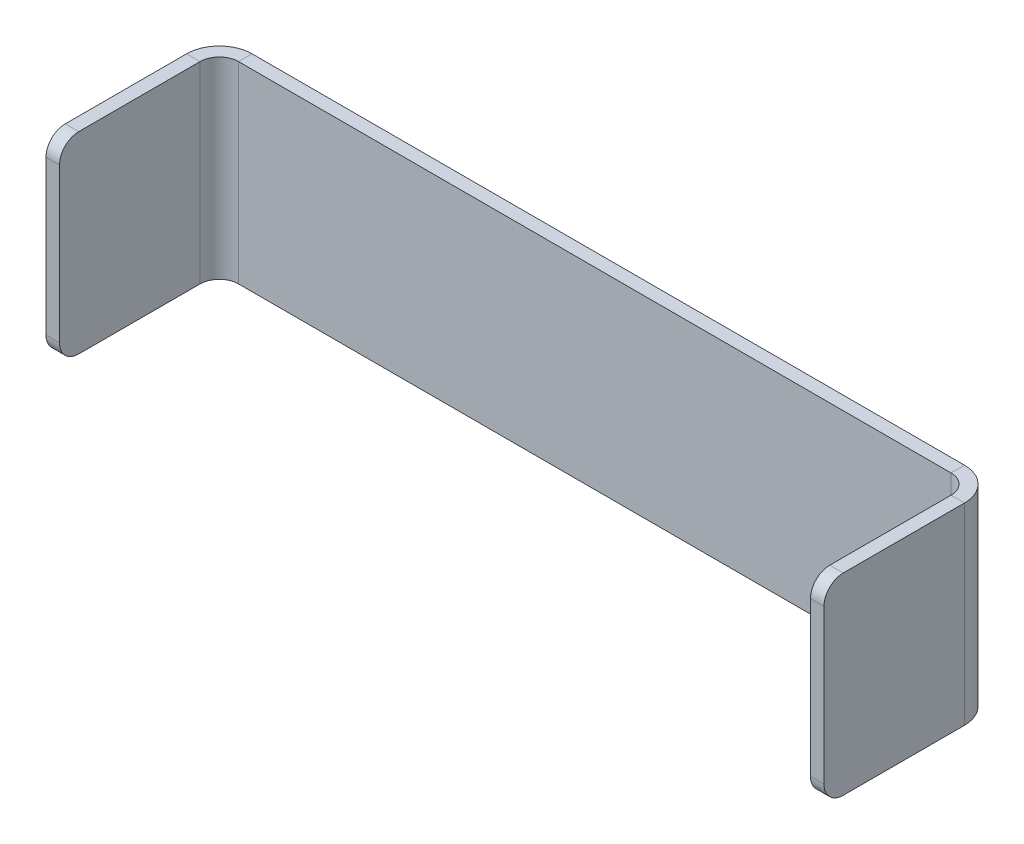
ISO-10303-21;
HEADER;
FILE_DESCRIPTION(('STEP AP214'),'2;1');
FILE_NAME('part.step','',(''),(''),'','','');
FILE_SCHEMA(('AUTOMOTIVE_DESIGN { 1 0 10303 214 1 1 1 1 }'));
ENDSEC;
DATA;
#1=APPLICATION_CONTEXT('core data for automotive mechanical design processes');
#2=APPLICATION_PROTOCOL_DEFINITION('international standard','automotive_design',2000,#1);
#3=PRODUCT_CONTEXT('',#1,'mechanical');
#4=PRODUCT('Part','Part','',(#3));
#5=PRODUCT_RELATED_PRODUCT_CATEGORY('part','',(#4));
#6=PRODUCT_DEFINITION_FORMATION('','',#4);
#7=PRODUCT_DEFINITION_CONTEXT('part definition',#1,'design');
#8=PRODUCT_DEFINITION('design','',#6,#7);
#9=PRODUCT_DEFINITION_SHAPE('','',#8);
#10=(LENGTH_UNIT() NAMED_UNIT(*) SI_UNIT(.MILLI.,.METRE.));
#11=(NAMED_UNIT(*) PLANE_ANGLE_UNIT() SI_UNIT($,.RADIAN.));
#12=(NAMED_UNIT(*) SI_UNIT($,.STERADIAN.) SOLID_ANGLE_UNIT());
#13=UNCERTAINTY_MEASURE_WITH_UNIT(LENGTH_MEASURE(1.E-05),#10,'distance_accuracy_value','');
#14=(GEOMETRIC_REPRESENTATION_CONTEXT(3) GLOBAL_UNCERTAINTY_ASSIGNED_CONTEXT((#13)) GLOBAL_UNIT_ASSIGNED_CONTEXT((#10,
#11,#12)) REPRESENTATION_CONTEXT('',''));
#15=CARTESIAN_POINT('',(0.,0.,0.));
#16=DIRECTION('',(0.,0.,1.));
#17=DIRECTION('',(1.,0.,0.));
#18=AXIS2_PLACEMENT_3D('',#15,#16,#17);
#19=CARTESIAN_POINT('',(0.,0.,-0.7));
#20=DIRECTION('',(0.,0.,1.));
#21=DIRECTION('',(1.,0.,0.));
#22=AXIS2_PLACEMENT_3D('',#19,#20,#21);
#23=PLANE('',#22);
#24=DIRECTION('',(0.,1.,0.));
#25=VECTOR('',#24,1.);
#26=CARTESIAN_POINT('',(18.5,5.,-0.7));
#27=LINE('',#26,#25);
#28=CARTESIAN_POINT('',(18.5,4.99999999999999,-0.7));
#29=VERTEX_POINT('',#28);
#30=CARTESIAN_POINT('',(18.5,-4.99999999999999,-0.7));
#31=VERTEX_POINT('',#30);
#32=EDGE_CURVE('E162',#29,#31,#27,.F.);
#33=ORIENTED_EDGE('',*,*,#32,.T.);
#34=DIRECTION('',(1.,0.,0.));
#35=VECTOR('',#34,1.);
#36=CARTESIAN_POINT('',(-19.5,-5.,-0.7));
#37=LINE('',#36,#35);
#38=CARTESIAN_POINT('',(-18.5,-5.,-0.7));
#39=VERTEX_POINT('',#38);
#40=EDGE_CURVE('E264',#39,#31,#37,.T.);
#41=ORIENTED_EDGE('',*,*,#40,.F.);
#42=DIRECTION('',(0.,-1.,0.));
#43=VECTOR('',#42,1.);
#44=CARTESIAN_POINT('',(-18.5,-5.,-0.7));
#45=LINE('',#44,#43);
#46=CARTESIAN_POINT('',(-18.5,5.,-0.7));
#47=VERTEX_POINT('',#46);
#48=EDGE_CURVE('E238',#39,#47,#45,.F.);
#49=ORIENTED_EDGE('',*,*,#48,.T.);
#50=DIRECTION('',(-1.,0.,0.));
#51=VECTOR('',#50,1.);
#52=CARTESIAN_POINT('',(-19.5,5.,-0.7));
#53=LINE('',#52,#51);
#54=EDGE_CURVE('E262',#29,#47,#53,.T.);
#55=ORIENTED_EDGE('',*,*,#54,.F.);
#56=EDGE_LOOP('',(#33,#41,#49,#55));
#57=FACE_BOUND('',#56,.T.);
#58=ADVANCED_FACE('F39',(#57),#23,.F.);
#59=CARTESIAN_POINT('',(0.,0.,0.));
#60=DIRECTION('',(0.,0.,1.));
#61=DIRECTION('',(1.,0.,0.));
#62=AXIS2_PLACEMENT_3D('',#59,#60,#61);
#63=PLANE('',#62);
#64=DIRECTION('',(1.,0.,0.));
#65=VECTOR('',#64,1.);
#66=CARTESIAN_POINT('',(-19.5,-5.,0.));
#67=LINE('',#66,#65);
#68=CARTESIAN_POINT('',(-18.5,-5.,0.));
#69=VERTEX_POINT('',#68);
#70=CARTESIAN_POINT('',(18.5,-5.,0.));
#71=VERTEX_POINT('',#70);
#72=EDGE_CURVE('E265',#69,#71,#67,.T.);
#73=ORIENTED_EDGE('',*,*,#72,.T.);
#74=DIRECTION('',(0.,1.,0.));
#75=VECTOR('',#74,1.);
#76=CARTESIAN_POINT('',(18.5,5.,0.));
#77=LINE('',#76,#75);
#78=CARTESIAN_POINT('',(18.5,4.99999999999999,0.));
#79=VERTEX_POINT('',#78);
#80=EDGE_CURVE('E201',#79,#71,#77,.F.);
#81=ORIENTED_EDGE('',*,*,#80,.F.);
#82=DIRECTION('',(-1.,0.,0.));
#83=VECTOR('',#82,1.);
#84=CARTESIAN_POINT('',(-19.5,5.,0.));
#85=LINE('',#84,#83);
#86=CARTESIAN_POINT('',(-18.5,5.,0.));
#87=VERTEX_POINT('',#86);
#88=EDGE_CURVE('E259',#79,#87,#85,.T.);
#89=ORIENTED_EDGE('',*,*,#88,.T.);
#90=DIRECTION('',(0.,-1.,0.));
#91=VECTOR('',#90,1.);
#92=CARTESIAN_POINT('',(-18.5,-5.,0.));
#93=LINE('',#92,#91);
#94=EDGE_CURVE('E251',#69,#87,#93,.F.);
#95=ORIENTED_EDGE('',*,*,#94,.F.);
#96=EDGE_LOOP('',(#73,#81,#89,#95));
#97=FACE_BOUND('',#96,.T.);
#98=ADVANCED_FACE('F330',(#97),#63,.T.);
#99=CARTESIAN_POINT('',(-19.5,5.,-0.7));
#100=DIRECTION('',(0.,1.,0.));
#101=DIRECTION('',(0.,0.,1.));
#102=AXIS2_PLACEMENT_3D('',#99,#100,#101);
#103=PLANE('',#102);
#104=ORIENTED_EDGE('',*,*,#88,.F.);
#105=DIRECTION('',(0.,0.,-1.));
#106=VECTOR('',#105,1.);
#107=CARTESIAN_POINT('',(18.5,4.99999999999999,0.));
#108=LINE('',#107,#106);
#109=EDGE_CURVE('E197',#79,#29,#108,.T.);
#110=ORIENTED_EDGE('',*,*,#109,.T.);
#111=ORIENTED_EDGE('',*,*,#54,.T.);
#112=DIRECTION('',(0.,0.,-1.));
#113=VECTOR('',#112,1.);
#114=CARTESIAN_POINT('',(-18.5,5.,0.));
#115=LINE('',#114,#113);
#116=EDGE_CURVE('E256',#87,#47,#115,.T.);
#117=ORIENTED_EDGE('',*,*,#116,.F.);
#118=EDGE_LOOP('',(#104,#110,#111,#117));
#119=FACE_BOUND('',#118,.T.);
#120=ADVANCED_FACE('F385',(#119),#103,.T.);
#121=CARTESIAN_POINT('',(-19.5,-5.,-0.7));
#122=DIRECTION('',(0.,-1.,0.));
#123=DIRECTION('',(0.,0.,-1.));
#124=AXIS2_PLACEMENT_3D('',#121,#122,#123);
#125=PLANE('',#124);
#126=DIRECTION('',(0.,0.,-1.));
#127=VECTOR('',#126,1.);
#128=CARTESIAN_POINT('',(18.5,-5.,0.));
#129=LINE('',#128,#127);
#130=EDGE_CURVE('E205',#71,#31,#129,.T.);
#131=ORIENTED_EDGE('',*,*,#130,.F.);
#132=ORIENTED_EDGE('',*,*,#72,.F.);
#133=DIRECTION('',(0.,0.,-1.));
#134=VECTOR('',#133,1.);
#135=CARTESIAN_POINT('',(-18.5,-5.,0.));
#136=LINE('',#135,#134);
#137=EDGE_CURVE('E245',#69,#39,#136,.T.);
#138=ORIENTED_EDGE('',*,*,#137,.T.);
#139=ORIENTED_EDGE('',*,*,#40,.T.);
#140=EDGE_LOOP('',(#131,#132,#138,#139));
#141=FACE_BOUND('',#140,.T.);
#142=ADVANCED_FACE('F327',(#141),#125,.T.);
#143=CARTESIAN_POINT('',(-18.5,5.,1.));
#144=DIRECTION('',(0.,1.,0.));
#145=DIRECTION('',(0.,0.,1.));
#146=AXIS2_PLACEMENT_3D('',#143,#144,#145);
#147=PLANE('',#146);
#148=DIRECTION('',(-1.,0.,0.));
#149=VECTOR('',#148,1.);
#150=CARTESIAN_POINT('',(-19.5,5.,0.999999999999997));
#151=LINE('',#150,#149);
#152=CARTESIAN_POINT('',(-19.5,5.,0.999999999999997));
#153=VERTEX_POINT('',#152);
#154=CARTESIAN_POINT('',(-20.2,5.,0.999999999999995));
#155=VERTEX_POINT('',#154);
#156=EDGE_CURVE('E208',#153,#155,#151,.T.);
#157=ORIENTED_EDGE('',*,*,#156,.F.);
#158=CARTESIAN_POINT('',(-18.5,5.,1.));
#159=DIRECTION('',(0.,-1.,0.));
#160=DIRECTION('',(0.,0.,-1.));
#161=AXIS2_PLACEMENT_3D('',#158,#159,#160);
#162=CIRCLE('',#161,1.);
#163=EDGE_CURVE('E248',#87,#153,#162,.F.);
#164=ORIENTED_EDGE('',*,*,#163,.F.);
#165=ORIENTED_EDGE('',*,*,#116,.T.);
#166=CARTESIAN_POINT('',(-18.5,5.,1.));
#167=DIRECTION('',(0.,-1.,0.));
#168=DIRECTION('',(0.,0.,-1.));
#169=AXIS2_PLACEMENT_3D('',#166,#167,#168);
#170=CIRCLE('',#169,1.7);
#171=EDGE_CURVE('E241',#47,#155,#170,.F.);
#172=ORIENTED_EDGE('',*,*,#171,.T.);
#173=EDGE_LOOP('',(#157,#164,#165,#172));
#174=FACE_BOUND('',#173,.T.);
#175=ADVANCED_FACE('F340',(#174),#147,.T.);
#176=CARTESIAN_POINT('',(-18.5,-5.,1.));
#177=DIRECTION('',(0.,1.,0.));
#178=DIRECTION('',(0.,0.,1.));
#179=AXIS2_PLACEMENT_3D('',#176,#177,#178);
#180=PLANE('',#179);
#181=CARTESIAN_POINT('',(-18.5,-5.,1.));
#182=DIRECTION('',(0.,-1.,0.));
#183=DIRECTION('',(0.,0.,-1.));
#184=AXIS2_PLACEMENT_3D('',#181,#182,#183);
#185=CIRCLE('',#184,1.);
#186=CARTESIAN_POINT('',(-19.5,-5.,0.999999999999997));
#187=VERTEX_POINT('',#186);
#188=EDGE_CURVE('E231',#187,#69,#185,.T.);
#189=ORIENTED_EDGE('',*,*,#188,.F.);
#190=DIRECTION('',(-1.,0.,0.));
#191=VECTOR('',#190,1.);
#192=CARTESIAN_POINT('',(-19.5,-5.,0.999999999999997));
#193=LINE('',#192,#191);
#194=CARTESIAN_POINT('',(-20.2,-5.,0.999999999999995));
#195=VERTEX_POINT('',#194);
#196=EDGE_CURVE('E213',#187,#195,#193,.T.);
#197=ORIENTED_EDGE('',*,*,#196,.T.);
#198=CARTESIAN_POINT('',(-18.5,-5.,1.));
#199=DIRECTION('',(0.,-1.,0.));
#200=DIRECTION('',(0.,0.,-1.));
#201=AXIS2_PLACEMENT_3D('',#198,#199,#200);
#202=CIRCLE('',#201,1.7);
#203=EDGE_CURVE('E242',#195,#39,#202,.T.);
#204=ORIENTED_EDGE('',*,*,#203,.T.);
#205=ORIENTED_EDGE('',*,*,#137,.F.);
#206=EDGE_LOOP('',(#189,#197,#204,#205));
#207=FACE_BOUND('',#206,.T.);
#208=ADVANCED_FACE('F353',(#207),#180,.F.);
#209=CARTESIAN_POINT('',(-18.5,-5.,1.));
#210=DIRECTION('',(0.,-1.,0.));
#211=DIRECTION('',(-1.,0.,0.));
#212=AXIS2_PLACEMENT_3D('',#209,#210,#211);
#213=CYLINDRICAL_SURFACE('',#212,1.7);
#214=ORIENTED_EDGE('',*,*,#48,.F.);
#215=ORIENTED_EDGE('',*,*,#203,.F.);
#216=DIRECTION('',(0.,1.,0.));
#217=VECTOR('',#216,1.);
#218=CARTESIAN_POINT('',(-20.2,0.,0.999999999999995));
#219=LINE('',#218,#217);
#220=EDGE_CURVE('E216',#195,#155,#219,.T.);
#221=ORIENTED_EDGE('',*,*,#220,.T.);
#222=ORIENTED_EDGE('',*,*,#171,.F.);
#223=EDGE_LOOP('',(#214,#215,#221,#222));
#224=FACE_BOUND('',#223,.T.);
#225=ADVANCED_FACE('F398',(#224),#213,.T.);
#226=CARTESIAN_POINT('',(-18.5,-5.,1.));
#227=DIRECTION('',(0.,-1.,0.));
#228=DIRECTION('',(-1.,0.,0.));
#229=AXIS2_PLACEMENT_3D('',#226,#227,#228);
#230=CYLINDRICAL_SURFACE('',#229,1.);
#231=ORIENTED_EDGE('',*,*,#94,.T.);
#232=ORIENTED_EDGE('',*,*,#163,.T.);
#233=DIRECTION('',(0.,-1.,0.));
#234=VECTOR('',#233,1.);
#235=CARTESIAN_POINT('',(-19.5,5.,0.999999999999997));
#236=LINE('',#235,#234);
#237=EDGE_CURVE('E211',#153,#187,#236,.T.);
#238=ORIENTED_EDGE('',*,*,#237,.T.);
#239=ORIENTED_EDGE('',*,*,#188,.T.);
#240=EDGE_LOOP('',(#231,#232,#238,#239));
#241=FACE_BOUND('',#240,.T.);
#242=ADVANCED_FACE('F335',(#241),#230,.F.);
#243=CARTESIAN_POINT('',(-20.2,5.,0.));
#244=DIRECTION('',(0.,-1.,0.));
#245=DIRECTION('',(0.,0.,-1.));
#246=AXIS2_PLACEMENT_3D('',#243,#244,#245);
#247=PLANE('',#246);
#248=DIRECTION('',(0.,0.,-1.));
#249=VECTOR('',#248,1.);
#250=CARTESIAN_POINT('',(-20.2,5.,0.));
#251=LINE('',#250,#249);
#252=CARTESIAN_POINT('',(-20.2,5.,7.3));
#253=VERTEX_POINT('',#252);
#254=EDGE_CURVE('E222',#253,#155,#251,.T.);
#255=ORIENTED_EDGE('',*,*,#254,.F.);
#256=DIRECTION('',(1.,0.,0.));
#257=VECTOR('',#256,1.);
#258=CARTESIAN_POINT('',(-20.2,5.,7.3));
#259=LINE('',#258,#257);
#260=CARTESIAN_POINT('',(-19.5,5.,7.3));
#261=VERTEX_POINT('',#260);
#262=EDGE_CURVE('E286',#253,#261,#259,.T.);
#263=ORIENTED_EDGE('',*,*,#262,.T.);
#264=DIRECTION('',(0.,0.,-1.));
#265=VECTOR('',#264,1.);
#266=CARTESIAN_POINT('',(-19.5,5.,0.));
#267=LINE('',#266,#265);
#268=EDGE_CURVE('E221',#261,#153,#267,.T.);
#269=ORIENTED_EDGE('',*,*,#268,.T.);
#270=ORIENTED_EDGE('',*,*,#156,.T.);
#271=EDGE_LOOP('',(#255,#263,#269,#270));
#272=FACE_BOUND('',#271,.T.);
#273=ADVANCED_FACE('F344',(#272),#247,.F.);
#274=CARTESIAN_POINT('',(-20.2,-5.,8.3));
#275=DIRECTION('',(0.,1.,0.));
#276=DIRECTION('',(0.,0.,1.));
#277=AXIS2_PLACEMENT_3D('',#274,#275,#276);
#278=PLANE('',#277);
#279=DIRECTION('',(0.,0.,1.));
#280=VECTOR('',#279,1.);
#281=CARTESIAN_POINT('',(-19.5,-5.,8.3));
#282=LINE('',#281,#280);
#283=CARTESIAN_POINT('',(-19.5,-5.,7.3));
#284=VERTEX_POINT('',#283);
#285=EDGE_CURVE('E233',#187,#284,#282,.T.);
#286=ORIENTED_EDGE('',*,*,#285,.T.);
#287=DIRECTION('',(1.,0.,0.));
#288=VECTOR('',#287,1.);
#289=CARTESIAN_POINT('',(-20.2,-5.,7.3));
#290=LINE('',#289,#288);
#291=CARTESIAN_POINT('',(-20.2,-5.,7.3));
#292=VERTEX_POINT('',#291);
#293=EDGE_CURVE('E280',#284,#292,#290,.F.);
#294=ORIENTED_EDGE('',*,*,#293,.T.);
#295=DIRECTION('',(0.,0.,1.));
#296=VECTOR('',#295,1.);
#297=CARTESIAN_POINT('',(-20.2,-5.,8.3));
#298=LINE('',#297,#296);
#299=EDGE_CURVE('E224',#195,#292,#298,.T.);
#300=ORIENTED_EDGE('',*,*,#299,.F.);
#301=ORIENTED_EDGE('',*,*,#196,.F.);
#302=EDGE_LOOP('',(#286,#294,#300,#301));
#303=FACE_BOUND('',#302,.T.);
#304=ADVANCED_FACE('F357',(#303),#278,.F.);
#305=CARTESIAN_POINT('',(-20.2,0.,0.));
#306=DIRECTION('',(1.,0.,0.));
#307=DIRECTION('',(0.,0.,-1.));
#308=AXIS2_PLACEMENT_3D('',#305,#306,#307);
#309=PLANE('',#308);
#310=ORIENTED_EDGE('',*,*,#299,.T.);
#311=CARTESIAN_POINT('',(-20.2,-4.,7.3));
#312=DIRECTION('',(1.,0.,0.));
#313=DIRECTION('',(0.,0.,-1.));
#314=AXIS2_PLACEMENT_3D('',#311,#312,#313);
#315=CIRCLE('',#314,1.);
#316=CARTESIAN_POINT('',(-20.2,-4.,8.3));
#317=VERTEX_POINT('',#316);
#318=EDGE_CURVE('E284',#292,#317,#315,.F.);
#319=ORIENTED_EDGE('',*,*,#318,.T.);
#320=DIRECTION('',(0.,1.,0.));
#321=VECTOR('',#320,1.);
#322=CARTESIAN_POINT('',(-20.2,5.,8.3));
#323=LINE('',#322,#321);
#324=CARTESIAN_POINT('',(-20.2,4.,8.3));
#325=VERTEX_POINT('',#324);
#326=EDGE_CURVE('E228',#317,#325,#323,.T.);
#327=ORIENTED_EDGE('',*,*,#326,.T.);
#328=CARTESIAN_POINT('',(-20.2,4.,7.3));
#329=DIRECTION('',(1.,0.,0.));
#330=DIRECTION('',(0.,0.,-1.));
#331=AXIS2_PLACEMENT_3D('',#328,#329,#330);
#332=CIRCLE('',#331,1.);
#333=EDGE_CURVE('E282',#325,#253,#332,.F.);
#334=ORIENTED_EDGE('',*,*,#333,.T.);
#335=ORIENTED_EDGE('',*,*,#254,.T.);
#336=ORIENTED_EDGE('',*,*,#220,.F.);
#337=EDGE_LOOP('',(#310,#319,#327,#334,#335,#336));
#338=FACE_BOUND('',#337,.T.);
#339=ADVANCED_FACE('F361',(#338),#309,.F.);
#340=CARTESIAN_POINT('',(-19.5,0.,0.));
#341=DIRECTION('',(1.,0.,0.));
#342=DIRECTION('',(0.,0.,-1.));
#343=AXIS2_PLACEMENT_3D('',#340,#341,#342);
#344=PLANE('',#343);
#345=DIRECTION('',(0.,1.,0.));
#346=VECTOR('',#345,1.);
#347=CARTESIAN_POINT('',(-19.5,5.,8.3));
#348=LINE('',#347,#346);
#349=CARTESIAN_POINT('',(-19.5,-4.,8.3));
#350=VERTEX_POINT('',#349);
#351=CARTESIAN_POINT('',(-19.5,4.,8.3));
#352=VERTEX_POINT('',#351);
#353=EDGE_CURVE('E225',#350,#352,#348,.T.);
#354=ORIENTED_EDGE('',*,*,#353,.F.);
#355=CARTESIAN_POINT('',(-19.5,-4.,7.3));
#356=DIRECTION('',(1.,0.,0.));
#357=DIRECTION('',(0.,0.,-1.));
#358=AXIS2_PLACEMENT_3D('',#355,#356,#357);
#359=CIRCLE('',#358,1.);
#360=EDGE_CURVE('E278',#350,#284,#359,.T.);
#361=ORIENTED_EDGE('',*,*,#360,.T.);
#362=ORIENTED_EDGE('',*,*,#285,.F.);
#363=ORIENTED_EDGE('',*,*,#237,.F.);
#364=ORIENTED_EDGE('',*,*,#268,.F.);
#365=CARTESIAN_POINT('',(-19.5,4.,7.3));
#366=DIRECTION('',(1.,0.,0.));
#367=DIRECTION('',(0.,0.,-1.));
#368=AXIS2_PLACEMENT_3D('',#365,#366,#367);
#369=CIRCLE('',#368,1.);
#370=EDGE_CURVE('E276',#261,#352,#369,.T.);
#371=ORIENTED_EDGE('',*,*,#370,.T.);
#372=EDGE_LOOP('',(#354,#361,#362,#363,#364,#371));
#373=FACE_BOUND('',#372,.T.);
#374=ADVANCED_FACE('F349',(#373),#344,.T.);
#375=CARTESIAN_POINT('',(-20.2,5.,8.3));
#376=DIRECTION('',(0.,0.,-1.));
#377=DIRECTION('',(-1.,0.,0.));
#378=AXIS2_PLACEMENT_3D('',#375,#376,#377);
#379=PLANE('',#378);
#380=ORIENTED_EDGE('',*,*,#326,.F.);
#381=DIRECTION('',(1.,0.,0.));
#382=VECTOR('',#381,1.);
#383=CARTESIAN_POINT('',(-20.2,-4.,8.3));
#384=LINE('',#383,#382);
#385=EDGE_CURVE('E273',#317,#350,#384,.T.);
#386=ORIENTED_EDGE('',*,*,#385,.T.);
#387=ORIENTED_EDGE('',*,*,#353,.T.);
#388=DIRECTION('',(1.,0.,0.));
#389=VECTOR('',#388,1.);
#390=CARTESIAN_POINT('',(-20.2,4.,8.3));
#391=LINE('',#390,#389);
#392=EDGE_CURVE('E268',#352,#325,#391,.F.);
#393=ORIENTED_EDGE('',*,*,#392,.T.);
#394=EDGE_LOOP('',(#380,#386,#387,#393));
#395=FACE_BOUND('',#394,.T.);
#396=ADVANCED_FACE('F367',(#395),#379,.F.);
#397=CARTESIAN_POINT('',(18.5,-5.,1.));
#398=DIRECTION('',(0.,-1.,0.));
#399=DIRECTION('',(0.,0.,-1.));
#400=AXIS2_PLACEMENT_3D('',#397,#398,#399);
#401=PLANE('',#400);
#402=DIRECTION('',(1.,0.,0.));
#403=VECTOR('',#402,1.);
#404=CARTESIAN_POINT('',(19.5,-5.,0.999999999999997));
#405=LINE('',#404,#403);
#406=CARTESIAN_POINT('',(19.5,-5.,0.999999999999997));
#407=VERTEX_POINT('',#406);
#408=CARTESIAN_POINT('',(20.2,-5.,0.999999999999995));
#409=VERTEX_POINT('',#408);
#410=EDGE_CURVE('E309',#407,#409,#405,.T.);
#411=ORIENTED_EDGE('',*,*,#410,.F.);
#412=CARTESIAN_POINT('',(18.5,-5.,1.));
#413=DIRECTION('',(0.,1.,0.));
#414=DIRECTION('',(0.,0.,1.));
#415=AXIS2_PLACEMENT_3D('',#412,#413,#414);
#416=CIRCLE('',#415,1.);
#417=EDGE_CURVE('E165',#71,#407,#416,.F.);
#418=ORIENTED_EDGE('',*,*,#417,.F.);
#419=ORIENTED_EDGE('',*,*,#130,.T.);
#420=CARTESIAN_POINT('',(18.5,-5.,1.));
#421=DIRECTION('',(0.,1.,0.));
#422=DIRECTION('',(0.,0.,1.));
#423=AXIS2_PLACEMENT_3D('',#420,#421,#422);
#424=CIRCLE('',#423,1.7);
#425=EDGE_CURVE('E196',#31,#409,#424,.F.);
#426=ORIENTED_EDGE('',*,*,#425,.T.);
#427=EDGE_LOOP('',(#411,#418,#419,#426));
#428=FACE_BOUND('',#427,.T.);
#429=ADVANCED_FACE('F324',(#428),#401,.T.);
#430=CARTESIAN_POINT('',(18.5,4.99999999999999,1.));
#431=DIRECTION('',(0.,-1.,0.));
#432=DIRECTION('',(0.,0.,-1.));
#433=AXIS2_PLACEMENT_3D('',#430,#431,#432);
#434=PLANE('',#433);
#435=CARTESIAN_POINT('',(18.5,4.99999999999999,1.));
#436=DIRECTION('',(0.,1.,0.));
#437=DIRECTION('',(0.,0.,1.));
#438=AXIS2_PLACEMENT_3D('',#435,#436,#437);
#439=CIRCLE('',#438,1.);
#440=CARTESIAN_POINT('',(19.5,4.99999999999999,0.999999999999997));
#441=VERTEX_POINT('',#440);
#442=EDGE_CURVE('E172',#441,#79,#439,.T.);
#443=ORIENTED_EDGE('',*,*,#442,.F.);
#444=DIRECTION('',(1.,0.,0.));
#445=VECTOR('',#444,1.);
#446=CARTESIAN_POINT('',(19.5,4.99999999999999,0.999999999999997));
#447=LINE('',#446,#445);
#448=CARTESIAN_POINT('',(20.2,4.99999999999999,0.999999999999995));
#449=VERTEX_POINT('',#448);
#450=EDGE_CURVE('E169',#441,#449,#447,.T.);
#451=ORIENTED_EDGE('',*,*,#450,.T.);
#452=CARTESIAN_POINT('',(18.5,4.99999999999999,1.));
#453=DIRECTION('',(0.,1.,0.));
#454=DIRECTION('',(0.,0.,1.));
#455=AXIS2_PLACEMENT_3D('',#452,#453,#454);
#456=CIRCLE('',#455,1.7);
#457=EDGE_CURVE('E155',#449,#29,#456,.T.);
#458=ORIENTED_EDGE('',*,*,#457,.T.);
#459=ORIENTED_EDGE('',*,*,#109,.F.);
#460=EDGE_LOOP('',(#443,#451,#458,#459));
#461=FACE_BOUND('',#460,.T.);
#462=ADVANCED_FACE('F170',(#461),#434,.F.);
#463=CARTESIAN_POINT('',(18.5,5.,1.));
#464=DIRECTION('',(0.,1.,0.));
#465=DIRECTION('',(1.,0.,0.));
#466=AXIS2_PLACEMENT_3D('',#463,#464,#465);
#467=CYLINDRICAL_SURFACE('',#466,1.7);
#468=ORIENTED_EDGE('',*,*,#32,.F.);
#469=ORIENTED_EDGE('',*,*,#457,.F.);
#470=DIRECTION('',(0.,-1.,0.));
#471=VECTOR('',#470,1.);
#472=CARTESIAN_POINT('',(20.2,0.,0.999999999999995));
#473=LINE('',#472,#471);
#474=EDGE_CURVE('E160',#449,#409,#473,.T.);
#475=ORIENTED_EDGE('',*,*,#474,.T.);
#476=ORIENTED_EDGE('',*,*,#425,.F.);
#477=EDGE_LOOP('',(#468,#469,#475,#476));
#478=FACE_BOUND('',#477,.T.);
#479=ADVANCED_FACE('F157',(#478),#467,.T.);
#480=CARTESIAN_POINT('',(18.5,5.,1.));
#481=DIRECTION('',(0.,1.,0.));
#482=DIRECTION('',(1.,0.,0.));
#483=AXIS2_PLACEMENT_3D('',#480,#481,#482);
#484=CYLINDRICAL_SURFACE('',#483,1.);
#485=ORIENTED_EDGE('',*,*,#80,.T.);
#486=ORIENTED_EDGE('',*,*,#417,.T.);
#487=DIRECTION('',(0.,1.,0.));
#488=VECTOR('',#487,1.);
#489=CARTESIAN_POINT('',(19.5,-5.,0.999999999999997));
#490=LINE('',#489,#488);
#491=EDGE_CURVE('E174',#407,#441,#490,.T.);
#492=ORIENTED_EDGE('',*,*,#491,.T.);
#493=ORIENTED_EDGE('',*,*,#442,.T.);
#494=EDGE_LOOP('',(#485,#486,#492,#493));
#495=FACE_BOUND('',#494,.T.);
#496=ADVANCED_FACE('F321',(#495),#484,.F.);
#497=CARTESIAN_POINT('',(20.2,-5.,0.));
#498=DIRECTION('',(0.,1.,0.));
#499=DIRECTION('',(0.,0.,1.));
#500=AXIS2_PLACEMENT_3D('',#497,#498,#499);
#501=PLANE('',#500);
#502=DIRECTION('',(0.,0.,-1.));
#503=VECTOR('',#502,1.);
#504=CARTESIAN_POINT('',(20.2,-5.,0.));
#505=LINE('',#504,#503);
#506=CARTESIAN_POINT('',(20.2,-5.,7.3));
#507=VERTEX_POINT('',#506);
#508=EDGE_CURVE('E181',#507,#409,#505,.T.);
#509=ORIENTED_EDGE('',*,*,#508,.F.);
#510=DIRECTION('',(-1.,0.,0.));
#511=VECTOR('',#510,1.);
#512=CARTESIAN_POINT('',(20.2,-5.,7.3));
#513=LINE('',#512,#511);
#514=CARTESIAN_POINT('',(19.5,-5.,7.3));
#515=VERTEX_POINT('',#514);
#516=EDGE_CURVE('E289',#507,#515,#513,.T.);
#517=ORIENTED_EDGE('',*,*,#516,.T.);
#518=DIRECTION('',(0.,0.,-1.));
#519=VECTOR('',#518,1.);
#520=CARTESIAN_POINT('',(19.5,-5.,0.));
#521=LINE('',#520,#519);
#522=EDGE_CURVE('E182',#515,#407,#521,.T.);
#523=ORIENTED_EDGE('',*,*,#522,.T.);
#524=ORIENTED_EDGE('',*,*,#410,.T.);
#525=EDGE_LOOP('',(#509,#517,#523,#524));
#526=FACE_BOUND('',#525,.T.);
#527=ADVANCED_FACE('F306',(#526),#501,.F.);
#528=CARTESIAN_POINT('',(20.2,5.,8.3));
#529=DIRECTION('',(0.,-1.,0.));
#530=DIRECTION('',(0.,0.,-1.));
#531=AXIS2_PLACEMENT_3D('',#528,#529,#530);
#532=PLANE('',#531);
#533=DIRECTION('',(0.,0.,1.));
#534=VECTOR('',#533,1.);
#535=CARTESIAN_POINT('',(19.5,5.,8.3));
#536=LINE('',#535,#534);
#537=CARTESIAN_POINT('',(19.5,5.,7.3));
#538=VERTEX_POINT('',#537);
#539=EDGE_CURVE('E192',#441,#538,#536,.T.);
#540=ORIENTED_EDGE('',*,*,#539,.T.);
#541=DIRECTION('',(-1.,0.,0.));
#542=VECTOR('',#541,1.);
#543=CARTESIAN_POINT('',(20.2,5.,7.3));
#544=LINE('',#543,#542);
#545=CARTESIAN_POINT('',(20.2,5.,7.3));
#546=VERTEX_POINT('',#545);
#547=EDGE_CURVE('E11',#538,#546,#544,.F.);
#548=ORIENTED_EDGE('',*,*,#547,.T.);
#549=DIRECTION('',(0.,0.,1.));
#550=VECTOR('',#549,1.);
#551=CARTESIAN_POINT('',(20.2,5.,8.3));
#552=LINE('',#551,#550);
#553=EDGE_CURVE('E178',#449,#546,#552,.T.);
#554=ORIENTED_EDGE('',*,*,#553,.F.);
#555=ORIENTED_EDGE('',*,*,#450,.F.);
#556=EDGE_LOOP('',(#540,#548,#554,#555));
#557=FACE_BOUND('',#556,.T.);
#558=ADVANCED_FACE('F184',(#557),#532,.F.);
#559=CARTESIAN_POINT('',(20.2,0.,0.));
#560=DIRECTION('',(-1.,0.,0.));
#561=DIRECTION('',(0.,0.,1.));
#562=AXIS2_PLACEMENT_3D('',#559,#560,#561);
#563=PLANE('',#562);
#564=DIRECTION('',(0.,-1.,0.));
#565=VECTOR('',#564,1.);
#566=CARTESIAN_POINT('',(20.2,-5.,8.3));
#567=LINE('',#566,#565);
#568=CARTESIAN_POINT('',(20.2,4.,8.3));
#569=VERTEX_POINT('',#568);
#570=CARTESIAN_POINT('',(20.2,-4.,8.3));
#571=VERTEX_POINT('',#570);
#572=EDGE_CURVE('E185',#569,#571,#567,.T.);
#573=ORIENTED_EDGE('',*,*,#572,.T.);
#574=CARTESIAN_POINT('',(20.2,-4.,7.3));
#575=DIRECTION('',(-1.,0.,0.));
#576=DIRECTION('',(0.,0.,1.));
#577=AXIS2_PLACEMENT_3D('',#574,#575,#576);
#578=CIRCLE('',#577,1.);
#579=EDGE_CURVE('E47',#571,#507,#578,.F.);
#580=ORIENTED_EDGE('',*,*,#579,.T.);
#581=ORIENTED_EDGE('',*,*,#508,.T.);
#582=ORIENTED_EDGE('',*,*,#474,.F.);
#583=ORIENTED_EDGE('',*,*,#553,.T.);
#584=CARTESIAN_POINT('',(20.2,4.,7.3));
#585=DIRECTION('',(-1.,0.,0.));
#586=DIRECTION('',(0.,0.,1.));
#587=AXIS2_PLACEMENT_3D('',#584,#585,#586);
#588=CIRCLE('',#587,1.);
#589=EDGE_CURVE('E300',#546,#569,#588,.F.);
#590=ORIENTED_EDGE('',*,*,#589,.T.);
#591=EDGE_LOOP('',(#573,#580,#581,#582,#583,#590));
#592=FACE_BOUND('',#591,.T.);
#593=ADVANCED_FACE('F177',(#592),#563,.F.);
#594=CARTESIAN_POINT('',(19.5,0.,0.));
#595=DIRECTION('',(-1.,0.,0.));
#596=DIRECTION('',(0.,0.,1.));
#597=AXIS2_PLACEMENT_3D('',#594,#595,#596);
#598=PLANE('',#597);
#599=ORIENTED_EDGE('',*,*,#522,.F.);
#600=CARTESIAN_POINT('',(19.5,-4.,7.3));
#601=DIRECTION('',(-1.,0.,0.));
#602=DIRECTION('',(0.,0.,1.));
#603=AXIS2_PLACEMENT_3D('',#600,#601,#602);
#604=CIRCLE('',#603,1.);
#605=CARTESIAN_POINT('',(19.5,-4.,8.3));
#606=VERTEX_POINT('',#605);
#607=EDGE_CURVE('E294',#515,#606,#604,.T.);
#608=ORIENTED_EDGE('',*,*,#607,.T.);
#609=DIRECTION('',(0.,-1.,0.));
#610=VECTOR('',#609,1.);
#611=CARTESIAN_POINT('',(19.5,-5.,8.3));
#612=LINE('',#611,#610);
#613=CARTESIAN_POINT('',(19.5,4.,8.3));
#614=VERTEX_POINT('',#613);
#615=EDGE_CURVE('E188',#614,#606,#612,.T.);
#616=ORIENTED_EDGE('',*,*,#615,.F.);
#617=CARTESIAN_POINT('',(19.5,4.,7.3));
#618=DIRECTION('',(-1.,0.,0.));
#619=DIRECTION('',(0.,0.,1.));
#620=AXIS2_PLACEMENT_3D('',#617,#618,#619);
#621=CIRCLE('',#620,1.);
#622=EDGE_CURVE('E292',#614,#538,#621,.T.);
#623=ORIENTED_EDGE('',*,*,#622,.T.);
#624=ORIENTED_EDGE('',*,*,#539,.F.);
#625=ORIENTED_EDGE('',*,*,#491,.F.);
#626=EDGE_LOOP('',(#599,#608,#616,#623,#624,#625));
#627=FACE_BOUND('',#626,.T.);
#628=ADVANCED_FACE('F313',(#627),#598,.T.);
#629=CARTESIAN_POINT('',(20.2,-5.,8.3));
#630=DIRECTION('',(0.,0.,-1.));
#631=DIRECTION('',(-1.,0.,0.));
#632=AXIS2_PLACEMENT_3D('',#629,#630,#631);
#633=PLANE('',#632);
#634=ORIENTED_EDGE('',*,*,#615,.T.);
#635=DIRECTION('',(-1.,0.,0.));
#636=VECTOR('',#635,1.);
#637=CARTESIAN_POINT('',(20.2,-4.,8.3));
#638=LINE('',#637,#636);
#639=EDGE_CURVE('E60',#606,#571,#638,.F.);
#640=ORIENTED_EDGE('',*,*,#639,.T.);
#641=ORIENTED_EDGE('',*,*,#572,.F.);
#642=DIRECTION('',(-1.,0.,0.));
#643=VECTOR('',#642,1.);
#644=CARTESIAN_POINT('',(20.2,4.,8.3));
#645=LINE('',#644,#643);
#646=EDGE_CURVE('E296',#569,#614,#645,.T.);
#647=ORIENTED_EDGE('',*,*,#646,.T.);
#648=EDGE_LOOP('',(#634,#640,#641,#647));
#649=FACE_BOUND('',#648,.T.);
#650=ADVANCED_FACE('F315',(#649),#633,.F.);
#651=CARTESIAN_POINT('',(-20.2,-4.,7.3));
#652=DIRECTION('',(1.,0.,0.));
#653=DIRECTION('',(0.,0.,-1.));
#654=AXIS2_PLACEMENT_3D('',#651,#652,#653);
#655=CYLINDRICAL_SURFACE('',#654,1.);
#656=ORIENTED_EDGE('',*,*,#318,.F.);
#657=ORIENTED_EDGE('',*,*,#293,.F.);
#658=ORIENTED_EDGE('',*,*,#360,.F.);
#659=ORIENTED_EDGE('',*,*,#385,.F.);
#660=EDGE_LOOP('',(#656,#657,#658,#659));
#661=FACE_BOUND('',#660,.T.);
#662=ADVANCED_FACE('F365',(#661),#655,.T.);
#663=CARTESIAN_POINT('',(-20.2,4.,7.3));
#664=DIRECTION('',(1.,0.,0.));
#665=DIRECTION('',(0.,0.,-1.));
#666=AXIS2_PLACEMENT_3D('',#663,#664,#665);
#667=CYLINDRICAL_SURFACE('',#666,1.);
#668=ORIENTED_EDGE('',*,*,#333,.F.);
#669=ORIENTED_EDGE('',*,*,#392,.F.);
#670=ORIENTED_EDGE('',*,*,#370,.F.);
#671=ORIENTED_EDGE('',*,*,#262,.F.);
#672=EDGE_LOOP('',(#668,#669,#670,#671));
#673=FACE_BOUND('',#672,.T.);
#674=ADVANCED_FACE('F371',(#673),#667,.T.);
#675=CARTESIAN_POINT('',(20.2,-4.,7.3));
#676=DIRECTION('',(-1.,0.,0.));
#677=DIRECTION('',(0.,0.,1.));
#678=AXIS2_PLACEMENT_3D('',#675,#676,#677);
#679=CYLINDRICAL_SURFACE('',#678,1.);
#680=ORIENTED_EDGE('',*,*,#579,.F.);
#681=ORIENTED_EDGE('',*,*,#639,.F.);
#682=ORIENTED_EDGE('',*,*,#607,.F.);
#683=ORIENTED_EDGE('',*,*,#516,.F.);
#684=EDGE_LOOP('',(#680,#681,#682,#683));
#685=FACE_BOUND('',#684,.T.);
#686=ADVANCED_FACE('F310',(#685),#679,.T.);
#687=CARTESIAN_POINT('',(20.2,4.,7.3));
#688=DIRECTION('',(-1.,0.,0.));
#689=DIRECTION('',(0.,0.,1.));
#690=AXIS2_PLACEMENT_3D('',#687,#688,#689);
#691=CYLINDRICAL_SURFACE('',#690,1.);
#692=ORIENTED_EDGE('',*,*,#589,.F.);
#693=ORIENTED_EDGE('',*,*,#547,.F.);
#694=ORIENTED_EDGE('',*,*,#622,.F.);
#695=ORIENTED_EDGE('',*,*,#646,.F.);
#696=EDGE_LOOP('',(#692,#693,#694,#695));
#697=FACE_BOUND('',#696,.T.);
#698=ADVANCED_FACE('F41',(#697),#691,.T.);
#699=CLOSED_SHELL('',(#58,#98,#120,#142,#175,#208,#225,#242,#273,#304,#339,#374,#396,#429,#462,
#479,#496,#527,#558,#593,#628,#650,#662,#674,#686,#698));
#700=MANIFOLD_SOLID_BREP('B2',#699);
#701=ADVANCED_BREP_SHAPE_REPRESENTATION('',(#18,#700),#14);
#702=SHAPE_DEFINITION_REPRESENTATION(#9,#701);
ENDSEC;
END-ISO-10303-21;
